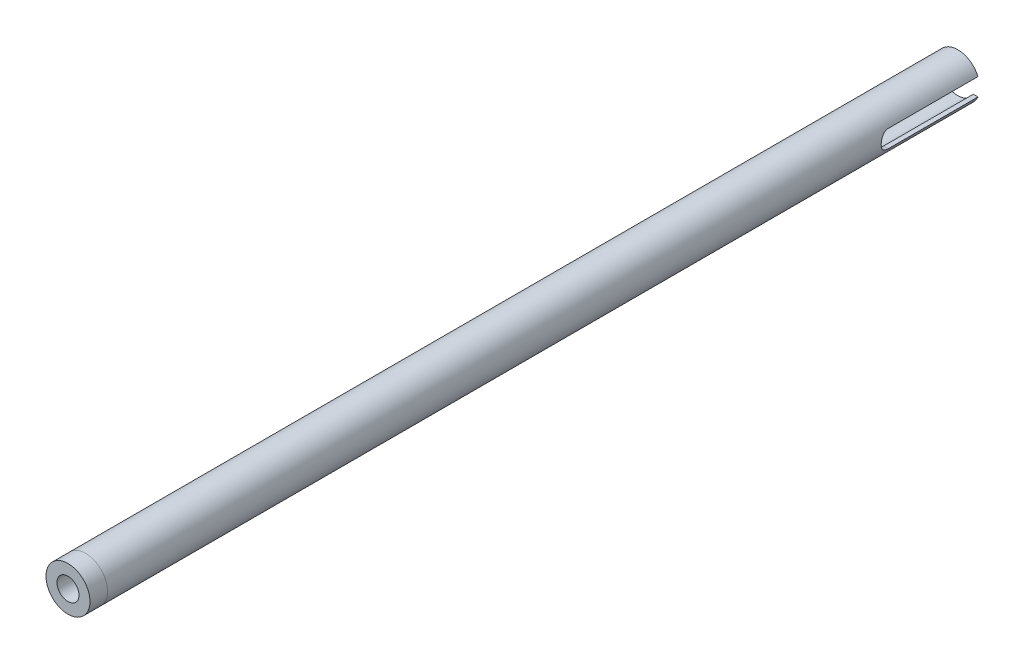
ISO-10303-21;
HEADER;
FILE_DESCRIPTION(('STEP AP214'),'2;1');
FILE_NAME('part.step','',(''),(''),'','','');
FILE_SCHEMA(('AUTOMOTIVE_DESIGN { 1 0 10303 214 1 1 1 1 }'));
ENDSEC;
DATA;
#1=APPLICATION_CONTEXT('core data for automotive mechanical design processes');
#2=APPLICATION_PROTOCOL_DEFINITION('international standard','automotive_design',2000,#1);
#3=PRODUCT_CONTEXT('',#1,'mechanical');
#4=PRODUCT('Part','Part','',(#3));
#5=PRODUCT_RELATED_PRODUCT_CATEGORY('part','',(#4));
#6=PRODUCT_DEFINITION_FORMATION('','',#4);
#7=PRODUCT_DEFINITION_CONTEXT('part definition',#1,'design');
#8=PRODUCT_DEFINITION('design','',#6,#7);
#9=PRODUCT_DEFINITION_SHAPE('','',#8);
#10=(LENGTH_UNIT() NAMED_UNIT(*) SI_UNIT(.MILLI.,.METRE.));
#11=(NAMED_UNIT(*) PLANE_ANGLE_UNIT() SI_UNIT($,.RADIAN.));
#12=(NAMED_UNIT(*) SI_UNIT($,.STERADIAN.) SOLID_ANGLE_UNIT());
#13=UNCERTAINTY_MEASURE_WITH_UNIT(LENGTH_MEASURE(1.E-05),#10,'distance_accuracy_value','');
#14=(GEOMETRIC_REPRESENTATION_CONTEXT(3) GLOBAL_UNCERTAINTY_ASSIGNED_CONTEXT((#13)) GLOBAL_UNIT_ASSIGNED_CONTEXT((#10,
#11,#12)) REPRESENTATION_CONTEXT('',''));
#15=CARTESIAN_POINT('',(0.,0.,0.));
#16=DIRECTION('',(0.,0.,1.));
#17=DIRECTION('',(1.,0.,0.));
#18=AXIS2_PLACEMENT_3D('',#15,#16,#17);
#19=CARTESIAN_POINT('',(0.,0.,-320.87871921738));
#20=DIRECTION('',(0.,0.,1.));
#21=DIRECTION('',(1.,0.,0.));
#22=AXIS2_PLACEMENT_3D('',#19,#20,#21);
#23=CYLINDRICAL_SURFACE('',#22,7.9375);
#24=CARTESIAN_POINT('',(0.,0.,-6.35));
#25=DIRECTION('',(0.,0.,1.));
#26=DIRECTION('',(1.,0.,0.));
#27=AXIS2_PLACEMENT_3D('',#24,#25,#26);
#28=CIRCLE('',#27,7.9375);
#29=CARTESIAN_POINT('',(7.9375,0.,-6.35));
#30=VERTEX_POINT('',#29);
#31=EDGE_CURVE('E167',#30,#30,#28,.T.);
#32=ORIENTED_EDGE('',*,*,#31,.F.);
#33=EDGE_LOOP('',(#32));
#34=FACE_BOUND('',#33,.T.);
#35=CARTESIAN_POINT('',(-7.2748389157424,3.175,-288.49371921738));
#36=CARTESIAN_POINT('',(-7.27482137043434,3.17501267173453,-288.408299101898));
#37=CARTESIAN_POINT('',(-7.27634297592672,3.17155313247793,-288.322888572335));
#38=CARTESIAN_POINT('',(-7.28233338484875,3.15778866907725,-288.152756568007));
#39=CARTESIAN_POINT('',(-7.28680106535325,3.14748635311323,-288.068034843148));
#40=CARTESIAN_POINT('',(-7.2985291631267,3.12019002880163,-287.900221143339));
#41=CARTESIAN_POINT('',(-7.30577831906487,3.10322299732752,-287.81712399858));
#42=CARTESIAN_POINT('',(-7.32282161153744,3.06278779397035,-287.652812896554));
#43=CARTESIAN_POINT('',(-7.33261590324725,3.03931922568674,-287.571599054441));
#44=CARTESIAN_POINT('',(-7.36535331460444,2.95952924342962,-287.331774231858));
#45=CARTESIAN_POINT('',(-7.39167595677839,2.89376893609239,-287.176649303055));
#46=CARTESIAN_POINT('',(-7.45033259991547,2.73920602658923,-286.879561876343));
#47=CARTESIAN_POINT('',(-7.48267254395243,2.65038060922872,-286.737612601125));
#48=CARTESIAN_POINT('',(-7.55175295441386,2.44684429809695,-286.462891831606));
#49=CARTESIAN_POINT('',(-7.58863404630154,2.33103943595689,-286.330964447094));
#50=CARTESIAN_POINT('',(-7.66147718953598,2.07914562663536,-286.087801563462));
#51=CARTESIAN_POINT('',(-7.69743902899202,1.94305205135848,-285.976570798534));
#52=CARTESIAN_POINT('',(-7.76611692840651,1.64778282664419,-285.773649599039));
#53=CARTESIAN_POINT('',(-7.79864638434712,1.48790317306356,-285.682915187635));
#54=CARTESIAN_POINT('',(-7.85502980346525,1.15369615984563,-285.530057634218));
#55=CARTESIAN_POINT('',(-7.87889360585224,0.979385463602722,-285.4679020216));
#56=CARTESIAN_POINT('',(-7.91022225039827,0.670405323433354,-285.387390377944));
#57=CARTESIAN_POINT('',(-7.92038443902171,0.537888188660439,-285.361712454535));
#58=CARTESIAN_POINT('',(-7.93061686811603,0.337231082382107,-285.335957371453));
#59=CARTESIAN_POINT('',(-7.93319257341971,0.269991647180298,-285.329499274173));
#60=CARTESIAN_POINT('',(-7.93663621925193,0.135173873369596,-285.320878256421));
#61=CARTESIAN_POINT('',(-7.93750363389236,0.0675954368175869,-285.318716658602));
#62=CARTESIAN_POINT('',(-7.9375,0.,-285.31871921738));
#63=B_SPLINE_CURVE_WITH_KNOTS('',3,(#35,#36,#37,#38,#39,#40,#41,#42,#43,#44,#45,#46,#47,#48,#49,
#50,#51,#52,#53,#54,#55,#56,#57,#58,#59,#60,#61,#62),.UNSPECIFIED.,.F.,.F.,(4,2,2,2,2,2,2,2,2,2,
2,2,2,4),(0.,0.256160797396612,0.512224013007058,0.767261264672238,1.02231406945471,
1.53142416248594,2.04103978047897,2.57679273649398,3.11266809162683,3.66991136029742,
4.22651992730645,4.63134321412666,4.8339937586662,5.03670667834028),.UNSPECIFIED.);
#64=CARTESIAN_POINT('',(-7.2748389157424,3.175,-288.49371921738));
#65=VERTEX_POINT('',#64);
#66=CARTESIAN_POINT('',(-7.9375,0.,-285.31871921738));
#67=VERTEX_POINT('',#66);
#68=EDGE_CURVE('E194',#65,#67,#63,.T.);
#69=ORIENTED_EDGE('',*,*,#68,.T.);
#70=CARTESIAN_POINT('',(-7.9375,0.,-285.31871921738));
#71=CARTESIAN_POINT('',(-7.93751279435796,-0.08569732438932,-285.318707187211));
#72=CARTESIAN_POINT('',(-7.93611246860092,-0.171386675169294,-285.322188554683));
#73=CARTESIAN_POINT('',(-7.93058107051394,-0.342092796869093,-285.336044650017));
#74=CARTESIAN_POINT('',(-7.92645080745519,-0.427109759557725,-285.346417335001));
#75=CARTESIAN_POINT('',(-7.91557399086504,-0.595570690948326,-285.373914529068));
#76=CARTESIAN_POINT('',(-7.90883664469869,-0.679019123580016,-285.391015280341));
#77=CARTESIAN_POINT('',(-7.89293284658536,-0.844038966454648,-285.431782527815));
#78=CARTESIAN_POINT('',(-7.88376629739099,-0.925610301410305,-285.455449286871));
#79=CARTESIAN_POINT('',(-7.85297007832481,-1.16656173687588,-285.53595694257));
#80=CARTESIAN_POINT('',(-7.82802544143958,-1.32244720282989,-285.602349575447));
#81=CARTESIAN_POINT('',(-7.77174407779742,-1.62081902572888,-285.75839497944));
#82=CARTESIAN_POINT('',(-7.74040257287306,-1.7632952496653,-285.848065151503));
#83=CARTESIAN_POINT('',(-7.67287736621953,-2.03755465224644,-286.052518759018));
#84=CARTESIAN_POINT('',(-7.63654472176442,-2.16862853615059,-286.16820561575));
#85=CARTESIAN_POINT('',(-7.56380976030912,-2.41011022612819,-286.419499717459));
#86=CARTESIAN_POINT('',(-7.52740741976911,-2.52050895891189,-286.555115661941));
#87=CARTESIAN_POINT('',(-7.45683282624284,-2.72240939900242,-286.849814156807));
#88=CARTESIAN_POINT('',(-7.4228346735038,-2.81283701743189,-287.009678146723));
#89=CARTESIAN_POINT('',(-7.3633362219632,-2.96511894168388,-287.343804111519));
#90=CARTESIAN_POINT('',(-7.33782422493328,-3.02701262758154,-287.518045849279));
#91=CARTESIAN_POINT('',(-7.30424985403508,-3.10695047193342,-287.82634957393));
#92=CARTESIAN_POINT('',(-7.29331360019113,-3.13238569878909,-287.958208334816));
#93=CARTESIAN_POINT('',(-7.28227977674291,-3.15790858319001,-288.15792521651));
#94=CARTESIAN_POINT('',(-7.27949685702346,-3.16431127275807,-288.224873507269));
#95=CARTESIAN_POINT('',(-7.27577355567174,-3.17285909036155,-288.359115065136));
#96=CARTESIAN_POINT('',(-7.27483380475762,-3.1750027609968,-288.426408442434));
#97=CARTESIAN_POINT('',(-7.2748389157424,-3.175,-288.49371921738));
#98=B_SPLINE_CURVE_WITH_KNOTS('',3,(#70,#71,#72,#73,#74,#75,#76,#77,#78,#79,#80,#81,#82,#83,#84,
#85,#86,#87,#88,#89,#90,#91,#92,#93,#94,#95,#96,#97),.UNSPECIFIED.,.F.,.F.,(4,2,2,2,2,2,2,2,2,2,
2,2,2,4),(0.,0.256996432008011,0.513916713336987,0.769937797705391,1.02596913282157,
1.53722547809954,2.04886511530059,2.58219314099272,3.11575467201799,3.67332953074261,
4.2301325519037,4.63306130520182,4.83485003827446,5.03670780985613),.UNSPECIFIED.);
#99=CARTESIAN_POINT('',(-7.2748389157424,-3.175,-288.49371921738));
#100=VERTEX_POINT('',#99);
#101=EDGE_CURVE('E146',#67,#100,#98,.T.);
#102=ORIENTED_EDGE('',*,*,#101,.T.);
#103=DIRECTION('',(0.,0.,-1.));
#104=VECTOR('',#103,1.);
#105=CARTESIAN_POINT('',(-7.2748389157424,-3.175,-285.31871921738));
#106=LINE('',#105,#104);
#107=CARTESIAN_POINT('',(-7.2748389157424,-3.175,-320.87871921738));
#108=VERTEX_POINT('',#107);
#109=EDGE_CURVE('E141',#100,#108,#106,.T.);
#110=ORIENTED_EDGE('',*,*,#109,.T.);
#111=CARTESIAN_POINT('',(0.,0.,-320.87871921738));
#112=DIRECTION('',(0.,0.,1.));
#113=DIRECTION('',(1.,0.,0.));
#114=AXIS2_PLACEMENT_3D('',#111,#112,#113);
#115=CIRCLE('',#114,7.9375);
#116=CARTESIAN_POINT('',(7.2748389157424,-3.175,-320.87871921738));
#117=VERTEX_POINT('',#116);
#118=EDGE_CURVE('E144',#108,#117,#115,.T.);
#119=ORIENTED_EDGE('',*,*,#118,.T.);
#120=DIRECTION('',(0.,0.,-1.));
#121=VECTOR('',#120,1.);
#122=CARTESIAN_POINT('',(7.2748389157424,-3.175,-285.31871921738));
#123=LINE('',#122,#121);
#124=CARTESIAN_POINT('',(7.2748389157424,-3.175,-288.49371921738));
#125=VERTEX_POINT('',#124);
#126=EDGE_CURVE('E427',#125,#117,#123,.T.);
#127=ORIENTED_EDGE('',*,*,#126,.F.);
#128=CARTESIAN_POINT('',(7.2748389157424,-3.175,-288.49371921738));
#129=CARTESIAN_POINT('',(7.27482137043434,-3.17501267173453,-288.408299101898));
#130=CARTESIAN_POINT('',(7.27634297592672,-3.17155313247793,-288.322888572335));
#131=CARTESIAN_POINT('',(7.28233338484875,-3.15778866907725,-288.152756568007));
#132=CARTESIAN_POINT('',(7.28680106535325,-3.14748635311323,-288.068034843148));
#133=CARTESIAN_POINT('',(7.2985291631267,-3.12019002880163,-287.900221143339));
#134=CARTESIAN_POINT('',(7.30577831906487,-3.10322299732752,-287.81712399858));
#135=CARTESIAN_POINT('',(7.32282161153744,-3.06278779397035,-287.652812896554));
#136=CARTESIAN_POINT('',(7.33261590324725,-3.03931922568674,-287.571599054441));
#137=CARTESIAN_POINT('',(7.36535331460444,-2.95952924342962,-287.331774231858));
#138=CARTESIAN_POINT('',(7.39167595677839,-2.89376893609239,-287.176649303055));
#139=CARTESIAN_POINT('',(7.45033259991547,-2.73920602658923,-286.879561876343));
#140=CARTESIAN_POINT('',(7.48267254395243,-2.65038060922872,-286.737612601125));
#141=CARTESIAN_POINT('',(7.55175295441386,-2.44684429809695,-286.462891831606));
#142=CARTESIAN_POINT('',(7.58863404630154,-2.33103943595689,-286.330964447094));
#143=CARTESIAN_POINT('',(7.66147718953598,-2.07914562663536,-286.087801563462));
#144=CARTESIAN_POINT('',(7.69743902899202,-1.94305205135848,-285.976570798534));
#145=CARTESIAN_POINT('',(7.76611692840651,-1.64778282664419,-285.773649599039));
#146=CARTESIAN_POINT('',(7.79864638434712,-1.48790317306356,-285.682915187635));
#147=CARTESIAN_POINT('',(7.85502980346525,-1.15369615984563,-285.530057634218));
#148=CARTESIAN_POINT('',(7.87889360585224,-0.979385463602722,-285.4679020216));
#149=CARTESIAN_POINT('',(7.91022225039827,-0.670405323433354,-285.387390377944));
#150=CARTESIAN_POINT('',(7.92038443902171,-0.537888188660439,-285.361712454535));
#151=CARTESIAN_POINT('',(7.93061686811603,-0.337231082382107,-285.335957371453));
#152=CARTESIAN_POINT('',(7.93319257341971,-0.269991647180298,-285.329499274173));
#153=CARTESIAN_POINT('',(7.93663621925193,-0.135173873369596,-285.320878256421));
#154=CARTESIAN_POINT('',(7.93750363389236,-0.0675954368175869,-285.318716658602));
#155=CARTESIAN_POINT('',(7.9375,0.,-285.31871921738));
#156=B_SPLINE_CURVE_WITH_KNOTS('',3,(#128,#129,#130,#131,#132,#133,#134,#135,#136,#137,#138,
#139,#140,#141,#142,#143,#144,#145,#146,#147,#148,#149,#150,#151,#152,#153,#154,#155),
.UNSPECIFIED.,.F.,.F.,(4,2,2,2,2,2,2,2,2,2,2,2,2,4),(0.,0.256160797396612,0.512224013007058,
0.767261264672238,1.02231406945471,1.53142416248594,2.04103978047897,2.57679273649398,
3.11266809162683,3.66991136029742,4.22651992730645,4.63134321412666,4.8339937586662,
5.03670667834028),.UNSPECIFIED.);
#157=CARTESIAN_POINT('',(7.9375,0.,-285.31871921738));
#158=VERTEX_POINT('',#157);
#159=EDGE_CURVE('E87',#125,#158,#156,.T.);
#160=ORIENTED_EDGE('',*,*,#159,.T.);
#161=CARTESIAN_POINT('',(7.9375,0.,-285.31871921738));
#162=CARTESIAN_POINT('',(7.93751279435796,0.08569732438932,-285.318707187211));
#163=CARTESIAN_POINT('',(7.93611246860092,0.171386675169294,-285.322188554683));
#164=CARTESIAN_POINT('',(7.93058107051394,0.342092796869093,-285.336044650017));
#165=CARTESIAN_POINT('',(7.92645080745519,0.427109759557725,-285.346417335001));
#166=CARTESIAN_POINT('',(7.91557399086504,0.595570690948326,-285.373914529068));
#167=CARTESIAN_POINT('',(7.90883664469869,0.679019123580016,-285.391015280341));
#168=CARTESIAN_POINT('',(7.89293284658536,0.844038966454648,-285.431782527815));
#169=CARTESIAN_POINT('',(7.88376629739099,0.925610301410305,-285.455449286871));
#170=CARTESIAN_POINT('',(7.85297007832481,1.16656173687588,-285.53595694257));
#171=CARTESIAN_POINT('',(7.82802544143958,1.32244720282989,-285.602349575447));
#172=CARTESIAN_POINT('',(7.77174407779742,1.62081902572888,-285.75839497944));
#173=CARTESIAN_POINT('',(7.74040257287306,1.7632952496653,-285.848065151503));
#174=CARTESIAN_POINT('',(7.67287736621953,2.03755465224644,-286.052518759018));
#175=CARTESIAN_POINT('',(7.63654472176442,2.16862853615059,-286.16820561575));
#176=CARTESIAN_POINT('',(7.56380976030912,2.41011022612819,-286.419499717459));
#177=CARTESIAN_POINT('',(7.52740741976911,2.52050895891189,-286.555115661941));
#178=CARTESIAN_POINT('',(7.45683282624284,2.72240939900242,-286.849814156807));
#179=CARTESIAN_POINT('',(7.4228346735038,2.81283701743189,-287.009678146723));
#180=CARTESIAN_POINT('',(7.3633362219632,2.96511894168388,-287.343804111519));
#181=CARTESIAN_POINT('',(7.33782422493328,3.02701262758154,-287.518045849279));
#182=CARTESIAN_POINT('',(7.30424985403508,3.10695047193342,-287.82634957393));
#183=CARTESIAN_POINT('',(7.29331360019113,3.13238569878909,-287.958208334816));
#184=CARTESIAN_POINT('',(7.28227977674291,3.15790858319001,-288.15792521651));
#185=CARTESIAN_POINT('',(7.27949685702346,3.16431127275807,-288.224873507269));
#186=CARTESIAN_POINT('',(7.27577355567174,3.17285909036155,-288.359115065136));
#187=CARTESIAN_POINT('',(7.27483380475762,3.1750027609968,-288.426408442434));
#188=CARTESIAN_POINT('',(7.2748389157424,3.175,-288.49371921738));
#189=B_SPLINE_CURVE_WITH_KNOTS('',3,(#161,#162,#163,#164,#165,#166,#167,#168,#169,#170,#171,
#172,#173,#174,#175,#176,#177,#178,#179,#180,#181,#182,#183,#184,#185,#186,#187,#188),
.UNSPECIFIED.,.F.,.F.,(4,2,2,2,2,2,2,2,2,2,2,2,2,4),(0.,0.256996432008011,0.513916713336987,
0.769937797705391,1.02596913282157,1.53722547809954,2.04886511530059,2.58219314099272,
3.11575467201799,3.67332953074261,4.2301325519037,4.63306130520182,4.83485003827446,
5.03670780985613),.UNSPECIFIED.);
#190=CARTESIAN_POINT('',(7.2748389157424,3.175,-288.49371921738));
#191=VERTEX_POINT('',#190);
#192=EDGE_CURVE('E73',#158,#191,#189,.T.);
#193=ORIENTED_EDGE('',*,*,#192,.T.);
#194=DIRECTION('',(0.,0.,-1.));
#195=VECTOR('',#194,1.);
#196=CARTESIAN_POINT('',(7.2748389157424,3.175,-285.31871921738));
#197=LINE('',#196,#195);
#198=CARTESIAN_POINT('',(7.2748389157424,3.175,-320.87871921738));
#199=VERTEX_POINT('',#198);
#200=EDGE_CURVE('E160',#191,#199,#197,.T.);
#201=ORIENTED_EDGE('',*,*,#200,.T.);
#202=CARTESIAN_POINT('',(-7.2748389157424,3.175,-320.87871921738));
#203=VERTEX_POINT('',#202);
#204=EDGE_CURVE('E166',#199,#203,#115,.T.);
#205=ORIENTED_EDGE('',*,*,#204,.T.);
#206=DIRECTION('',(0.,0.,-1.));
#207=VECTOR('',#206,1.);
#208=CARTESIAN_POINT('',(-7.2748389157424,3.175,-285.31871921738));
#209=LINE('',#208,#207);
#210=EDGE_CURVE('E420',#65,#203,#209,.T.);
#211=ORIENTED_EDGE('',*,*,#210,.F.);
#212=EDGE_LOOP('',(#69,#102,#110,#119,#127,#160,#193,#201,#205,#211));
#213=FACE_BOUND('',#212,.T.);
#214=ADVANCED_FACE('F63',(#34,#213),#23,.T.);
#215=CARTESIAN_POINT('',(0.,0.,-320.87871921738));
#216=DIRECTION('',(0.,0.,1.));
#217=DIRECTION('',(1.,0.,0.));
#218=AXIS2_PLACEMENT_3D('',#215,#216,#217);
#219=PLANE('',#218);
#220=DIRECTION('',(1.,0.,0.));
#221=VECTOR('',#220,1.);
#222=CARTESIAN_POINT('',(0.,-3.175,-320.87871921738));
#223=LINE('',#222,#221);
#224=CARTESIAN_POINT('',(-5.57246419907746,-3.175,-320.87871921738));
#225=VERTEX_POINT('',#224);
#226=EDGE_CURVE('E153',#108,#225,#223,.T.);
#227=ORIENTED_EDGE('',*,*,#226,.T.);
#228=CARTESIAN_POINT('',(0.,0.,-320.87871921738));
#229=DIRECTION('',(0.,0.,1.));
#230=DIRECTION('',(1.,0.,0.));
#231=AXIS2_PLACEMENT_3D('',#228,#229,#230);
#232=CIRCLE('',#231,6.4135);
#233=CARTESIAN_POINT('',(5.57246419907746,-3.175,-320.87871921738));
#234=VERTEX_POINT('',#233);
#235=EDGE_CURVE('E275',#225,#234,#232,.T.);
#236=ORIENTED_EDGE('',*,*,#235,.T.);
#237=DIRECTION('',(1.,0.,0.));
#238=VECTOR('',#237,1.);
#239=CARTESIAN_POINT('',(0.,-3.175,-320.87871921738));
#240=LINE('',#239,#238);
#241=EDGE_CURVE('E165',#234,#117,#240,.T.);
#242=ORIENTED_EDGE('',*,*,#241,.T.);
#243=ORIENTED_EDGE('',*,*,#118,.F.);
#244=EDGE_LOOP('',(#227,#236,#242,#243));
#245=FACE_BOUND('',#244,.T.);
#246=ADVANCED_FACE('F163',(#245),#219,.F.);
#247=CARTESIAN_POINT('',(0.,0.,-320.87871921738));
#248=DIRECTION('',(0.,0.,1.));
#249=DIRECTION('',(1.,0.,0.));
#250=AXIS2_PLACEMENT_3D('',#247,#248,#249);
#251=CYLINDRICAL_SURFACE('',#250,6.4135);
#252=CARTESIAN_POINT('',(0.,0.,-6.35));
#253=DIRECTION('',(0.,0.,1.));
#254=DIRECTION('',(1.,0.,0.));
#255=AXIS2_PLACEMENT_3D('',#252,#253,#254);
#256=CIRCLE('',#255,6.4135);
#257=CARTESIAN_POINT('',(6.4135,0.,-6.35));
#258=VERTEX_POINT('',#257);
#259=EDGE_CURVE('E149',#258,#258,#256,.T.);
#260=ORIENTED_EDGE('',*,*,#259,.T.);
#261=EDGE_LOOP('',(#260));
#262=FACE_BOUND('',#261,.T.);
#263=DIRECTION('',(0.,0.,-1.));
#264=VECTOR('',#263,1.);
#265=CARTESIAN_POINT('',(-5.57246419907746,-3.175,-285.31871921738));
#266=LINE('',#265,#264);
#267=CARTESIAN_POINT('',(-5.57246419907746,-3.175,-288.49371921738));
#268=VERTEX_POINT('',#267);
#269=EDGE_CURVE('E150',#268,#225,#266,.T.);
#270=ORIENTED_EDGE('',*,*,#269,.F.);
#271=CARTESIAN_POINT('',(-5.57246419907746,-3.175,-288.49371921738));
#272=CARTESIAN_POINT('',(-5.57244013006406,-3.17501485930532,-288.410440104341));
#273=CARTESIAN_POINT('',(-5.57433046393327,-3.17172393593588,-288.327174337471));
#274=CARTESIAN_POINT('',(-5.58175879139227,-3.15864741746939,-288.161366752659));
#275=CARTESIAN_POINT('',(-5.58729459414879,-3.14886572313217,-288.078824530058));
#276=CARTESIAN_POINT('',(-5.60179156831922,-3.12299843383605,-287.915527723329));
#277=CARTESIAN_POINT('',(-5.61073298145,-3.10694918790095,-287.834765618415));
#278=CARTESIAN_POINT('',(-5.63171276239417,-3.06875665913499,-287.675121702914));
#279=CARTESIAN_POINT('',(-5.64375147558632,-3.04661269666535,-287.596240103094));
#280=CARTESIAN_POINT('',(-5.6838799338154,-2.97148657354666,-287.363506928096));
#281=CARTESIAN_POINT('',(-5.71602843451584,-2.90973243042152,-287.213086430857));
#282=CARTESIAN_POINT('',(-5.78746445334561,-2.76491119647661,-286.924629214029));
#283=CARTESIAN_POINT('',(-5.8267630725243,-2.68181088046089,-286.786612256663));
#284=CARTESIAN_POINT('',(-5.91189137020974,-2.48887418737119,-286.514815172634));
#285=CARTESIAN_POINT('',(-5.95799203211627,-2.37743022169016,-286.382258370183));
#286=CARTESIAN_POINT('',(-6.04933625068999,-2.13433179626949,-286.13679070111));
#287=CARTESIAN_POINT('',(-6.09457954365871,-2.00267122837297,-286.023885794097));
#288=CARTESIAN_POINT('',(-6.18270630442022,-1.71220053093684,-285.813566501645));
#289=CARTESIAN_POINT('',(-6.22523407848511,-1.55216870534977,-285.717676751214));
#290=CARTESIAN_POINT('',(-6.29953728626817,-1.21586879246633,-285.554827854897));
#291=CARTESIAN_POINT('',(-6.33132906884324,-1.03962591706377,-285.487824676854));
#292=CARTESIAN_POINT('',(-6.37455801221378,-0.719418942476251,-285.397952844523));
#293=CARTESIAN_POINT('',(-6.38903678436651,-0.577736145507957,-285.368380130159));
#294=CARTESIAN_POINT('',(-6.40364692368403,-0.362616983152034,-285.338659055844));
#295=CARTESIAN_POINT('',(-6.40733246196224,-0.290370591494075,-285.331191543207));
#296=CARTESIAN_POINT('',(-6.41226237468065,-0.145424356491903,-285.321218654269));
#297=CARTESIAN_POINT('',(-6.41350576158006,-0.0727243416303698,-285.318715285332));
#298=CARTESIAN_POINT('',(-6.4135,0.,-285.31871921738));
#299=B_SPLINE_CURVE_WITH_KNOTS('',3,(#271,#272,#273,#274,#275,#276,#277,#278,#279,#280,#281,
#282,#283,#284,#285,#286,#287,#288,#289,#290,#291,#292,#293,#294,#295,#296,#297,#298),
.UNSPECIFIED.,.F.,.F.,(4,2,2,2,2,2,2,2,2,2,2,2,2,4),(0.,0.249729002226608,0.499308060527582,
0.747460667546715,0.995640957972498,1.49055300136654,1.98624009021394,2.52160227908797,
3.05712653941521,3.62817923327589,4.19835836008502,4.63305000595099,4.85103401853339,
5.06910615989469),.UNSPECIFIED.);
#300=CARTESIAN_POINT('',(-6.4135,0.,-285.31871921738));
#301=VERTEX_POINT('',#300);
#302=EDGE_CURVE('E221',#268,#301,#299,.T.);
#303=ORIENTED_EDGE('',*,*,#302,.T.);
#304=CARTESIAN_POINT('',(-6.4135,0.,-285.31871921738));
#305=CARTESIAN_POINT('',(-6.41351478956105,0.0839162873638195,-285.318705817484));
#306=CARTESIAN_POINT('',(-6.41185341043851,0.167823114288182,-285.322045743531));
#307=CARTESIAN_POINT('',(-6.40528923860734,0.33495253632637,-285.335328184136));
#308=CARTESIAN_POINT('',(-6.40038773102953,0.418175389480093,-285.345268080957));
#309=CARTESIAN_POINT('',(-6.38748331817869,0.58296549878522,-285.371586885475));
#310=CARTESIAN_POINT('',(-6.37949454331383,0.664538541389253,-285.387936460963));
#311=CARTESIAN_POINT('',(-6.36062930478242,0.825821595252368,-285.426874764556));
#312=CARTESIAN_POINT('',(-6.34975266552956,0.905531492908811,-285.449463872037));
#313=CARTESIAN_POINT('',(-6.31319792977548,1.14087800407252,-285.526200434797));
#314=CARTESIAN_POINT('',(-6.28356695572383,1.29306927815055,-285.589372082985));
#315=CARTESIAN_POINT('',(-6.21648032622801,1.58455945770353,-285.737522824965));
#316=CARTESIAN_POINT('',(-6.17901685649499,1.72384528592309,-285.822523716744));
#317=CARTESIAN_POINT('',(-6.09713913910647,1.99475482128856,-286.017623854996));
#318=CARTESIAN_POINT('',(-6.05244508581476,2.12544046453043,-286.128908731734));
#319=CARTESIAN_POINT('',(-5.96206469267669,2.36716277188881,-286.370878177899));
#320=CARTESIAN_POINT('',(-5.9163776032387,2.47818397002904,-286.501577869739));
#321=CARTESIAN_POINT('',(-5.82517699615972,2.68591268931947,-286.790623698691));
#322=CARTESIAN_POINT('',(-5.77994318763785,2.78087960507694,-286.950318893271));
#323=CARTESIAN_POINT('',(-5.69959190124919,2.9420744279085,-287.285702170453));
#324=CARTESIAN_POINT('',(-5.66445328320705,3.00836254036259,-287.461355803624));
#325=CARTESIAN_POINT('',(-5.61637168534323,3.09697219420915,-287.779807178018));
#326=CARTESIAN_POINT('',(-5.60011055849822,3.1260622343607,-287.920221780678));
#327=CARTESIAN_POINT('',(-5.58363385282995,3.15533369889112,-288.13359865892));
#328=CARTESIAN_POINT('',(-5.57946041232981,3.16269716900745,-288.205330383802));
#329=CARTESIAN_POINT('',(-5.57386984218861,3.17253394278506,-288.349272323845));
#330=CARTESIAN_POINT('',(-5.57245416126573,3.17500467618403,-288.421482770516));
#331=CARTESIAN_POINT('',(-5.57246419907746,3.175,-288.49371921738));
#332=B_SPLINE_CURVE_WITH_KNOTS('',3,(#304,#305,#306,#307,#308,#309,#310,#311,#312,#313,#314,
#315,#316,#317,#318,#319,#320,#321,#322,#323,#324,#325,#326,#327,#328,#329,#330,#331),
.UNSPECIFIED.,.F.,.F.,(4,2,2,2,2,2,2,2,2,2,2,2,2,4),(0.,0.251650249697328,0.503200747298848,
0.75361328099314,1.00404104361821,1.50387930503274,2.00421864304453,2.53410176460237,
3.06439980342596,3.63519589642624,4.20478783377489,4.63602373673194,4.85251353275904,
5.06911702550462),.UNSPECIFIED.);
#333=CARTESIAN_POINT('',(-5.57246419907746,3.175,-288.49371921738));
#334=VERTEX_POINT('',#333);
#335=EDGE_CURVE('E186',#301,#334,#332,.T.);
#336=ORIENTED_EDGE('',*,*,#335,.T.);
#337=DIRECTION('',(0.,0.,-1.));
#338=VECTOR('',#337,1.);
#339=CARTESIAN_POINT('',(-5.57246419907746,3.175,-285.31871921738));
#340=LINE('',#339,#338);
#341=CARTESIAN_POINT('',(-5.57246419907746,3.175,-320.87871921738));
#342=VERTEX_POINT('',#341);
#343=EDGE_CURVE('E417',#334,#342,#340,.T.);
#344=ORIENTED_EDGE('',*,*,#343,.T.);
#345=CARTESIAN_POINT('',(5.57246419907746,3.175,-320.87871921738));
#346=VERTEX_POINT('',#345);
#347=EDGE_CURVE('E172',#346,#342,#232,.T.);
#348=ORIENTED_EDGE('',*,*,#347,.F.);
#349=DIRECTION('',(0.,0.,-1.));
#350=VECTOR('',#349,1.);
#351=CARTESIAN_POINT('',(5.57246419907746,3.175,-285.31871921738));
#352=LINE('',#351,#350);
#353=CARTESIAN_POINT('',(5.57246419907746,3.175,-288.49371921738));
#354=VERTEX_POINT('',#353);
#355=EDGE_CURVE('E269',#354,#346,#352,.T.);
#356=ORIENTED_EDGE('',*,*,#355,.F.);
#357=CARTESIAN_POINT('',(5.57246419907746,3.175,-288.49371921738));
#358=CARTESIAN_POINT('',(5.57244013006406,3.17501485930532,-288.410440104341));
#359=CARTESIAN_POINT('',(5.57433046393327,3.17172393593588,-288.327174337471));
#360=CARTESIAN_POINT('',(5.58175879139227,3.15864741746939,-288.161366752659));
#361=CARTESIAN_POINT('',(5.58729459414879,3.14886572313217,-288.078824530058));
#362=CARTESIAN_POINT('',(5.60179156831922,3.12299843383605,-287.915527723329));
#363=CARTESIAN_POINT('',(5.61073298145,3.10694918790095,-287.834765618415));
#364=CARTESIAN_POINT('',(5.63171276239417,3.06875665913499,-287.675121702914));
#365=CARTESIAN_POINT('',(5.64375147558632,3.04661269666535,-287.596240103094));
#366=CARTESIAN_POINT('',(5.6838799338154,2.97148657354666,-287.363506928096));
#367=CARTESIAN_POINT('',(5.71602843451584,2.90973243042152,-287.213086430857));
#368=CARTESIAN_POINT('',(5.78746445334561,2.76491119647661,-286.924629214029));
#369=CARTESIAN_POINT('',(5.8267630725243,2.68181088046089,-286.786612256663));
#370=CARTESIAN_POINT('',(5.91189137020974,2.48887418737119,-286.514815172634));
#371=CARTESIAN_POINT('',(5.95799203211627,2.37743022169016,-286.382258370183));
#372=CARTESIAN_POINT('',(6.04933625068999,2.13433179626949,-286.13679070111));
#373=CARTESIAN_POINT('',(6.09457954365871,2.00267122837297,-286.023885794097));
#374=CARTESIAN_POINT('',(6.18270630442022,1.71220053093684,-285.813566501645));
#375=CARTESIAN_POINT('',(6.22523407848511,1.55216870534977,-285.717676751214));
#376=CARTESIAN_POINT('',(6.29953728626817,1.21586879246633,-285.554827854897));
#377=CARTESIAN_POINT('',(6.33132906884324,1.03962591706377,-285.487824676854));
#378=CARTESIAN_POINT('',(6.37455801221378,0.719418942476251,-285.397952844523));
#379=CARTESIAN_POINT('',(6.38903678436651,0.577736145507957,-285.368380130159));
#380=CARTESIAN_POINT('',(6.40364692368403,0.362616983152034,-285.338659055844));
#381=CARTESIAN_POINT('',(6.40733246196224,0.290370591494075,-285.331191543207));
#382=CARTESIAN_POINT('',(6.41226237468065,0.145424356491903,-285.321218654269));
#383=CARTESIAN_POINT('',(6.41350576158006,0.0727243416303698,-285.318715285332));
#384=CARTESIAN_POINT('',(6.4135,0.,-285.31871921738));
#385=B_SPLINE_CURVE_WITH_KNOTS('',3,(#357,#358,#359,#360,#361,#362,#363,#364,#365,#366,#367,
#368,#369,#370,#371,#372,#373,#374,#375,#376,#377,#378,#379,#380,#381,#382,#383,#384),
.UNSPECIFIED.,.F.,.F.,(4,2,2,2,2,2,2,2,2,2,2,2,2,4),(0.,0.249729002226608,0.499308060527582,
0.747460667546715,0.995640957972498,1.49055300136654,1.98624009021394,2.52160227908797,
3.05712653941521,3.62817923327589,4.19835836008502,4.63305000595099,4.85103401853339,
5.06910615989469),.UNSPECIFIED.);
#386=CARTESIAN_POINT('',(6.4135,0.,-285.31871921738));
#387=VERTEX_POINT('',#386);
#388=EDGE_CURVE('E13',#354,#387,#385,.T.);
#389=ORIENTED_EDGE('',*,*,#388,.T.);
#390=CARTESIAN_POINT('',(6.4135,0.,-285.31871921738));
#391=CARTESIAN_POINT('',(6.41351478956105,-0.0839162873638195,-285.318705817484));
#392=CARTESIAN_POINT('',(6.41185341043851,-0.167823114288182,-285.322045743531));
#393=CARTESIAN_POINT('',(6.40528923860734,-0.33495253632637,-285.335328184136));
#394=CARTESIAN_POINT('',(6.40038773102953,-0.418175389480093,-285.345268080957));
#395=CARTESIAN_POINT('',(6.38748331817869,-0.58296549878522,-285.371586885475));
#396=CARTESIAN_POINT('',(6.37949454331383,-0.664538541389253,-285.387936460963));
#397=CARTESIAN_POINT('',(6.36062930478242,-0.825821595252368,-285.426874764556));
#398=CARTESIAN_POINT('',(6.34975266552956,-0.905531492908811,-285.449463872037));
#399=CARTESIAN_POINT('',(6.31319792977548,-1.14087800407252,-285.526200434797));
#400=CARTESIAN_POINT('',(6.28356695572383,-1.29306927815055,-285.589372082985));
#401=CARTESIAN_POINT('',(6.21648032622801,-1.58455945770353,-285.737522824965));
#402=CARTESIAN_POINT('',(6.17901685649499,-1.72384528592309,-285.822523716744));
#403=CARTESIAN_POINT('',(6.09713913910647,-1.99475482128856,-286.017623854996));
#404=CARTESIAN_POINT('',(6.05244508581476,-2.12544046453043,-286.128908731734));
#405=CARTESIAN_POINT('',(5.96206469267669,-2.36716277188881,-286.370878177899));
#406=CARTESIAN_POINT('',(5.9163776032387,-2.47818397002904,-286.501577869739));
#407=CARTESIAN_POINT('',(5.82517699615972,-2.68591268931947,-286.790623698691));
#408=CARTESIAN_POINT('',(5.77994318763785,-2.78087960507694,-286.950318893271));
#409=CARTESIAN_POINT('',(5.69959190124919,-2.9420744279085,-287.285702170453));
#410=CARTESIAN_POINT('',(5.66445328320705,-3.00836254036259,-287.461355803624));
#411=CARTESIAN_POINT('',(5.61637168534323,-3.09697219420915,-287.779807178018));
#412=CARTESIAN_POINT('',(5.60011055849822,-3.1260622343607,-287.920221780678));
#413=CARTESIAN_POINT('',(5.58363385282995,-3.15533369889112,-288.13359865892));
#414=CARTESIAN_POINT('',(5.57946041232981,-3.16269716900745,-288.205330383802));
#415=CARTESIAN_POINT('',(5.57386984218861,-3.17253394278506,-288.349272323845));
#416=CARTESIAN_POINT('',(5.57245416126573,-3.17500467618403,-288.421482770516));
#417=CARTESIAN_POINT('',(5.57246419907746,-3.175,-288.49371921738));
#418=B_SPLINE_CURVE_WITH_KNOTS('',3,(#390,#391,#392,#393,#394,#395,#396,#397,#398,#399,#400,
#401,#402,#403,#404,#405,#406,#407,#408,#409,#410,#411,#412,#413,#414,#415,#416,#417),
.UNSPECIFIED.,.F.,.F.,(4,2,2,2,2,2,2,2,2,2,2,2,2,4),(0.,0.251650249697328,0.503200747298848,
0.75361328099314,1.00404104361821,1.50387930503274,2.00421864304453,2.53410176460237,
3.06439980342596,3.63519589642624,4.20478783377489,4.63602373673194,4.85251353275904,
5.06911702550462),.UNSPECIFIED.);
#419=CARTESIAN_POINT('',(5.57246419907746,-3.175,-288.49371921738));
#420=VERTEX_POINT('',#419);
#421=EDGE_CURVE('E237',#387,#420,#418,.T.);
#422=ORIENTED_EDGE('',*,*,#421,.T.);
#423=DIRECTION('',(0.,0.,-1.));
#424=VECTOR('',#423,1.);
#425=CARTESIAN_POINT('',(5.57246419907746,-3.175,-285.31871921738));
#426=LINE('',#425,#424);
#427=EDGE_CURVE('E271',#420,#234,#426,.T.);
#428=ORIENTED_EDGE('',*,*,#427,.T.);
#429=ORIENTED_EDGE('',*,*,#235,.F.);
#430=EDGE_LOOP('',(#270,#303,#336,#344,#348,#356,#389,#422,#428,#429));
#431=FACE_BOUND('',#430,.T.);
#432=ADVANCED_FACE('F201',(#262,#431),#251,.F.);
#433=ORIENTED_EDGE('',*,*,#347,.T.);
#434=DIRECTION('',(1.,0.,0.));
#435=VECTOR('',#434,1.);
#436=CARTESIAN_POINT('',(0.,3.175,-320.87871921738));
#437=LINE('',#436,#435);
#438=EDGE_CURVE('E159',#203,#342,#437,.T.);
#439=ORIENTED_EDGE('',*,*,#438,.F.);
#440=ORIENTED_EDGE('',*,*,#204,.F.);
#441=DIRECTION('',(1.,0.,0.));
#442=VECTOR('',#441,1.);
#443=CARTESIAN_POINT('',(0.,3.175,-320.87871921738));
#444=LINE('',#443,#442);
#445=EDGE_CURVE('E253',#346,#199,#444,.T.);
#446=ORIENTED_EDGE('',*,*,#445,.F.);
#447=EDGE_LOOP('',(#433,#439,#440,#446));
#448=FACE_BOUND('',#447,.T.);
#449=ADVANCED_FACE('F286',(#448),#219,.F.);
#450=CARTESIAN_POINT('',(0.,0.,-6.35));
#451=DIRECTION('',(0.,0.,1.));
#452=DIRECTION('',(1.,0.,0.));
#453=AXIS2_PLACEMENT_3D('',#450,#451,#452);
#454=PLANE('',#453);
#455=ORIENTED_EDGE('',*,*,#259,.F.);
#456=EDGE_LOOP('',(#455));
#457=FACE_BOUND('',#456,.T.);
#458=ORIENTED_EDGE('',*,*,#31,.T.);
#459=EDGE_LOOP('',(#458));
#460=FACE_BOUND('',#459,.T.);
#461=ADVANCED_FACE('F283',(#457,#460),#454,.T.);
#462=CARTESIAN_POINT('',(0.,3.175,-285.31871921738));
#463=DIRECTION('',(0.,1.,0.));
#464=DIRECTION('',(0.,0.,1.));
#465=AXIS2_PLACEMENT_3D('',#462,#463,#464);
#466=PLANE('',#465);
#467=ORIENTED_EDGE('',*,*,#200,.F.);
#468=DIRECTION('',(1.,0.,0.));
#469=VECTOR('',#468,1.);
#470=CARTESIAN_POINT('',(5.57246419907746,3.175,-288.49371921738));
#471=LINE('',#470,#469);
#472=EDGE_CURVE('E184',#191,#354,#471,.F.);
#473=ORIENTED_EDGE('',*,*,#472,.T.);
#474=ORIENTED_EDGE('',*,*,#355,.T.);
#475=ORIENTED_EDGE('',*,*,#445,.T.);
#476=EDGE_LOOP('',(#467,#473,#474,#475));
#477=FACE_BOUND('',#476,.T.);
#478=ADVANCED_FACE('F266',(#477),#466,.F.);
#479=CARTESIAN_POINT('',(0.,-3.175,-285.31871921738));
#480=DIRECTION('',(0.,1.,0.));
#481=DIRECTION('',(0.,0.,1.));
#482=AXIS2_PLACEMENT_3D('',#479,#480,#481);
#483=PLANE('',#482);
#484=ORIENTED_EDGE('',*,*,#427,.F.);
#485=DIRECTION('',(1.,0.,0.));
#486=VECTOR('',#485,1.);
#487=CARTESIAN_POINT('',(0.,-3.175,-288.49371921738));
#488=LINE('',#487,#486);
#489=EDGE_CURVE('E181',#420,#125,#488,.T.);
#490=ORIENTED_EDGE('',*,*,#489,.T.);
#491=ORIENTED_EDGE('',*,*,#126,.T.);
#492=ORIENTED_EDGE('',*,*,#241,.F.);
#493=EDGE_LOOP('',(#484,#490,#491,#492));
#494=FACE_BOUND('',#493,.T.);
#495=ADVANCED_FACE('F361',(#494),#483,.T.);
#496=CARTESIAN_POINT('',(0.,-3.175,-285.31871921738));
#497=DIRECTION('',(0.,1.,0.));
#498=DIRECTION('',(0.,0.,1.));
#499=AXIS2_PLACEMENT_3D('',#496,#497,#498);
#500=PLANE('',#499);
#501=ORIENTED_EDGE('',*,*,#109,.F.);
#502=DIRECTION('',(1.,0.,0.));
#503=VECTOR('',#502,1.);
#504=CARTESIAN_POINT('',(0.,-3.175,-288.49371921738));
#505=LINE('',#504,#503);
#506=EDGE_CURVE('E179',#100,#268,#505,.T.);
#507=ORIENTED_EDGE('',*,*,#506,.T.);
#508=ORIENTED_EDGE('',*,*,#269,.T.);
#509=ORIENTED_EDGE('',*,*,#226,.F.);
#510=EDGE_LOOP('',(#501,#507,#508,#509));
#511=FACE_BOUND('',#510,.T.);
#512=ADVANCED_FACE('F154',(#511),#500,.T.);
#513=CARTESIAN_POINT('',(0.,3.175,-285.31871921738));
#514=DIRECTION('',(0.,1.,0.));
#515=DIRECTION('',(0.,0.,1.));
#516=AXIS2_PLACEMENT_3D('',#513,#514,#515);
#517=PLANE('',#516);
#518=ORIENTED_EDGE('',*,*,#343,.F.);
#519=DIRECTION('',(1.,0.,0.));
#520=VECTOR('',#519,1.);
#521=CARTESIAN_POINT('',(-7.2748389157424,3.175,-288.49371921738));
#522=LINE('',#521,#520);
#523=EDGE_CURVE('E170',#334,#65,#522,.F.);
#524=ORIENTED_EDGE('',*,*,#523,.T.);
#525=ORIENTED_EDGE('',*,*,#210,.T.);
#526=ORIENTED_EDGE('',*,*,#438,.T.);
#527=EDGE_LOOP('',(#518,#524,#525,#526));
#528=FACE_BOUND('',#527,.T.);
#529=ADVANCED_FACE('F216',(#528),#517,.F.);
#530=CARTESIAN_POINT('',(0.,0.,-288.49371921738));
#531=DIRECTION('',(1.,0.,0.));
#532=DIRECTION('',(0.,0.,-1.));
#533=AXIS2_PLACEMENT_3D('',#530,#531,#532);
#534=CYLINDRICAL_SURFACE('',#533,3.175);
#535=ORIENTED_EDGE('',*,*,#506,.F.);
#536=ORIENTED_EDGE('',*,*,#101,.F.);
#537=DIRECTION('',(1.,0.,0.));
#538=VECTOR('',#537,1.);
#539=CARTESIAN_POINT('',(0.,0.,-285.31871921738));
#540=LINE('',#539,#538);
#541=EDGE_CURVE('E251',#301,#67,#540,.F.);
#542=ORIENTED_EDGE('',*,*,#541,.F.);
#543=ORIENTED_EDGE('',*,*,#302,.F.);
#544=EDGE_LOOP('',(#535,#536,#542,#543));
#545=FACE_BOUND('',#544,.T.);
#546=ADVANCED_FACE('F209',(#545),#534,.F.);
#547=CARTESIAN_POINT('',(0.,0.,-288.49371921738));
#548=DIRECTION('',(-1.,0.,0.));
#549=DIRECTION('',(0.,0.,1.));
#550=AXIS2_PLACEMENT_3D('',#547,#548,#549);
#551=CYLINDRICAL_SURFACE('',#550,3.175);
#552=ORIENTED_EDGE('',*,*,#68,.F.);
#553=ORIENTED_EDGE('',*,*,#523,.F.);
#554=ORIENTED_EDGE('',*,*,#335,.F.);
#555=ORIENTED_EDGE('',*,*,#541,.T.);
#556=EDGE_LOOP('',(#552,#553,#554,#555));
#557=FACE_BOUND('',#556,.T.);
#558=ADVANCED_FACE('F205',(#557),#551,.F.);
#559=CARTESIAN_POINT('',(0.,0.,-288.49371921738));
#560=DIRECTION('',(-1.,0.,0.));
#561=DIRECTION('',(0.,0.,1.));
#562=AXIS2_PLACEMENT_3D('',#559,#560,#561);
#563=CYLINDRICAL_SURFACE('',#562,3.175);
#564=DIRECTION('',(1.,0.,0.));
#565=VECTOR('',#564,1.);
#566=CARTESIAN_POINT('',(7.2748389157424,0.,-285.31871921738));
#567=LINE('',#566,#565);
#568=EDGE_CURVE('E68',#387,#158,#567,.T.);
#569=ORIENTED_EDGE('',*,*,#568,.F.);
#570=ORIENTED_EDGE('',*,*,#388,.F.);
#571=ORIENTED_EDGE('',*,*,#472,.F.);
#572=ORIENTED_EDGE('',*,*,#192,.F.);
#573=EDGE_LOOP('',(#569,#570,#571,#572));
#574=FACE_BOUND('',#573,.T.);
#575=ADVANCED_FACE('F65',(#574),#563,.F.);
#576=CARTESIAN_POINT('',(0.,0.,-288.49371921738));
#577=DIRECTION('',(1.,0.,0.));
#578=DIRECTION('',(0.,0.,-1.));
#579=AXIS2_PLACEMENT_3D('',#576,#577,#578);
#580=CYLINDRICAL_SURFACE('',#579,3.175);
#581=ORIENTED_EDGE('',*,*,#421,.F.);
#582=ORIENTED_EDGE('',*,*,#568,.T.);
#583=ORIENTED_EDGE('',*,*,#159,.F.);
#584=ORIENTED_EDGE('',*,*,#489,.F.);
#585=EDGE_LOOP('',(#581,#582,#583,#584));
#586=FACE_BOUND('',#585,.T.);
#587=ADVANCED_FACE('F218',(#586),#580,.F.);
#588=CLOSED_SHELL('',(#214,#246,#432,#449,#461,#478,#495,#512,#529,#546,#558,#575,#587));
#589=MANIFOLD_SOLID_BREP('B2',#588);
#590=CARTESIAN_POINT('',(0.,0.,-6.35));
#591=DIRECTION('',(0.,0.,1.));
#592=DIRECTION('',(1.,0.,0.));
#593=AXIS2_PLACEMENT_3D('',#590,#591,#592);
#594=CYLINDRICAL_SURFACE('',#593,7.9375);
#595=CARTESIAN_POINT('',(0.,0.,-6.35));
#596=DIRECTION('',(0.,0.,1.));
#597=DIRECTION('',(1.,0.,0.));
#598=AXIS2_PLACEMENT_3D('',#595,#596,#597);
#599=CIRCLE('',#598,7.9375);
#600=CARTESIAN_POINT('',(7.9375,0.,-6.35));
#601=VERTEX_POINT('',#600);
#602=EDGE_CURVE('E62',#601,#601,#599,.T.);
#603=ORIENTED_EDGE('',*,*,#602,.T.);
#604=EDGE_LOOP('',(#603));
#605=FACE_BOUND('',#604,.T.);
#606=CARTESIAN_POINT('',(0.,0.,0.));
#607=DIRECTION('',(0.,0.,1.));
#608=DIRECTION('',(1.,0.,0.));
#609=AXIS2_PLACEMENT_3D('',#606,#607,#608);
#610=CIRCLE('',#609,7.9375);
#611=CARTESIAN_POINT('',(7.9375,0.,0.));
#612=VERTEX_POINT('',#611);
#613=EDGE_CURVE('E465',#612,#612,#610,.T.);
#614=ORIENTED_EDGE('',*,*,#613,.F.);
#615=EDGE_LOOP('',(#614));
#616=FACE_BOUND('',#615,.T.);
#617=ADVANCED_FACE('F454',(#605,#616),#594,.T.);
#618=CARTESIAN_POINT('',(0.,0.,-6.35));
#619=DIRECTION('',(0.,0.,1.));
#620=DIRECTION('',(1.,0.,0.));
#621=AXIS2_PLACEMENT_3D('',#618,#619,#620);
#622=CYLINDRICAL_SURFACE('',#621,3.96875);
#623=CARTESIAN_POINT('',(0.,0.,0.));
#624=DIRECTION('',(0.,0.,1.));
#625=DIRECTION('',(1.,0.,0.));
#626=AXIS2_PLACEMENT_3D('',#623,#624,#625);
#627=CIRCLE('',#626,3.96875);
#628=CARTESIAN_POINT('',(3.96875,0.,0.));
#629=VERTEX_POINT('',#628);
#630=EDGE_CURVE('E457',#629,#629,#627,.T.);
#631=ORIENTED_EDGE('',*,*,#630,.T.);
#632=EDGE_LOOP('',(#631));
#633=FACE_BOUND('',#632,.T.);
#634=CARTESIAN_POINT('',(0.,0.,-15.875));
#635=DIRECTION('',(0.,0.,1.));
#636=DIRECTION('',(1.,0.,0.));
#637=AXIS2_PLACEMENT_3D('',#634,#635,#636);
#638=CIRCLE('',#637,3.96875);
#639=CARTESIAN_POINT('',(3.96875,0.,-15.875));
#640=VERTEX_POINT('',#639);
#641=EDGE_CURVE('E477',#640,#640,#638,.T.);
#642=ORIENTED_EDGE('',*,*,#641,.F.);
#643=EDGE_LOOP('',(#642));
#644=FACE_BOUND('',#643,.T.);
#645=ADVANCED_FACE('F485',(#633,#644),#622,.F.);
#646=CARTESIAN_POINT('',(0.,0.,-6.35));
#647=DIRECTION('',(0.,0.,1.));
#648=DIRECTION('',(1.,0.,0.));
#649=AXIS2_PLACEMENT_3D('',#646,#647,#648);
#650=PLANE('',#649);
#651=CARTESIAN_POINT('',(0.,0.,-6.35));
#652=DIRECTION('',(0.,0.,1.));
#653=DIRECTION('',(1.,0.,0.));
#654=AXIS2_PLACEMENT_3D('',#651,#652,#653);
#655=CIRCLE('',#654,6.4135);
#656=CARTESIAN_POINT('',(6.4135,0.,-6.35));
#657=VERTEX_POINT('',#656);
#658=EDGE_CURVE('E467',#657,#657,#655,.T.);
#659=ORIENTED_EDGE('',*,*,#658,.T.);
#660=EDGE_LOOP('',(#659));
#661=FACE_BOUND('',#660,.T.);
#662=ORIENTED_EDGE('',*,*,#602,.F.);
#663=EDGE_LOOP('',(#662));
#664=FACE_BOUND('',#663,.T.);
#665=ADVANCED_FACE('F487',(#661,#664),#650,.F.);
#666=CARTESIAN_POINT('',(0.,0.,0.));
#667=DIRECTION('',(0.,0.,1.));
#668=DIRECTION('',(1.,0.,0.));
#669=AXIS2_PLACEMENT_3D('',#666,#667,#668);
#670=PLANE('',#669);
#671=ORIENTED_EDGE('',*,*,#613,.T.);
#672=EDGE_LOOP('',(#671));
#673=FACE_BOUND('',#672,.T.);
#674=ORIENTED_EDGE('',*,*,#630,.F.);
#675=EDGE_LOOP('',(#674));
#676=FACE_BOUND('',#675,.T.);
#677=ADVANCED_FACE('F493',(#673,#676),#670,.T.);
#678=CARTESIAN_POINT('',(0.,0.,-15.875));
#679=DIRECTION('',(0.,0.,1.));
#680=DIRECTION('',(1.,0.,0.));
#681=AXIS2_PLACEMENT_3D('',#678,#679,#680);
#682=CYLINDRICAL_SURFACE('',#681,6.4135);
#683=CARTESIAN_POINT('',(0.,0.,-15.875));
#684=DIRECTION('',(0.,0.,1.));
#685=DIRECTION('',(1.,0.,0.));
#686=AXIS2_PLACEMENT_3D('',#683,#684,#685);
#687=CIRCLE('',#686,6.4135);
#688=CARTESIAN_POINT('',(6.4135,0.,-15.875));
#689=VERTEX_POINT('',#688);
#690=EDGE_CURVE('E470',#689,#689,#687,.T.);
#691=CARTESIAN_POINT('',(6.4135,0.,-15.875));
#692=CARTESIAN_POINT('',(6.4135,0.,-15.77578125));
#693=CARTESIAN_POINT('',(6.4135,0.,-15.6765625));
#694=CARTESIAN_POINT('',(6.4135,0.,-15.478125));
#695=CARTESIAN_POINT('',(6.4135,0.,-15.37890625));
#696=CARTESIAN_POINT('',(6.4135,0.,-15.18046875));
#697=CARTESIAN_POINT('',(6.4135,0.,-15.08125));
#698=CARTESIAN_POINT('',(6.4135,0.,-14.8828125));
#699=CARTESIAN_POINT('',(6.4135,0.,-14.78359375));
#700=CARTESIAN_POINT('',(6.4135,0.,-14.58515625));
#701=CARTESIAN_POINT('',(6.4135,0.,-14.4859375));
#702=CARTESIAN_POINT('',(6.4135,0.,-14.2875));
#703=CARTESIAN_POINT('',(6.4135,0.,-14.18828125));
#704=CARTESIAN_POINT('',(6.4135,0.,-13.98984375));
#705=CARTESIAN_POINT('',(6.4135,0.,-13.890625));
#706=CARTESIAN_POINT('',(6.4135,0.,-13.6921875));
#707=CARTESIAN_POINT('',(6.4135,0.,-13.59296875));
#708=CARTESIAN_POINT('',(6.4135,0.,-13.39453125));
#709=CARTESIAN_POINT('',(6.4135,0.,-13.2953125));
#710=CARTESIAN_POINT('',(6.4135,0.,-13.096875));
#711=CARTESIAN_POINT('',(6.4135,0.,-12.99765625));
#712=CARTESIAN_POINT('',(6.4135,0.,-12.79921875));
#713=CARTESIAN_POINT('',(6.4135,0.,-12.7));
#714=CARTESIAN_POINT('',(6.4135,0.,-12.5015625));
#715=CARTESIAN_POINT('',(6.4135,0.,-12.40234375));
#716=CARTESIAN_POINT('',(6.4135,0.,-12.20390625));
#717=CARTESIAN_POINT('',(6.4135,0.,-12.1046875));
#718=CARTESIAN_POINT('',(6.4135,0.,-11.90625));
#719=CARTESIAN_POINT('',(6.4135,0.,-11.80703125));
#720=CARTESIAN_POINT('',(6.4135,0.,-11.60859375));
#721=CARTESIAN_POINT('',(6.4135,0.,-11.509375));
#722=CARTESIAN_POINT('',(6.4135,0.,-11.3109375));
#723=CARTESIAN_POINT('',(6.4135,0.,-11.21171875));
#724=CARTESIAN_POINT('',(6.4135,0.,-11.01328125));
#725=CARTESIAN_POINT('',(6.4135,0.,-10.9140625));
#726=CARTESIAN_POINT('',(6.4135,0.,-10.715625));
#727=CARTESIAN_POINT('',(6.4135,0.,-10.61640625));
#728=CARTESIAN_POINT('',(6.4135,0.,-10.41796875));
#729=CARTESIAN_POINT('',(6.4135,0.,-10.31875));
#730=CARTESIAN_POINT('',(6.4135,0.,-10.1203125));
#731=CARTESIAN_POINT('',(6.4135,0.,-10.02109375));
#732=CARTESIAN_POINT('',(6.4135,0.,-9.82265625));
#733=CARTESIAN_POINT('',(6.4135,0.,-9.7234375));
#734=CARTESIAN_POINT('',(6.4135,0.,-9.525));
#735=CARTESIAN_POINT('',(6.4135,0.,-9.42578125));
#736=CARTESIAN_POINT('',(6.4135,0.,-9.22734375));
#737=CARTESIAN_POINT('',(6.4135,0.,-9.128125));
#738=CARTESIAN_POINT('',(6.4135,0.,-8.9296875));
#739=CARTESIAN_POINT('',(6.4135,0.,-8.83046875));
#740=CARTESIAN_POINT('',(6.4135,0.,-8.63203125));
#741=CARTESIAN_POINT('',(6.4135,0.,-8.5328125));
#742=CARTESIAN_POINT('',(6.4135,0.,-8.334375));
#743=CARTESIAN_POINT('',(6.4135,0.,-8.23515625));
#744=CARTESIAN_POINT('',(6.4135,0.,-8.03671875));
#745=CARTESIAN_POINT('',(6.4135,0.,-7.9375));
#746=CARTESIAN_POINT('',(6.4135,0.,-7.7390625));
#747=CARTESIAN_POINT('',(6.4135,0.,-7.63984375));
#748=CARTESIAN_POINT('',(6.4135,0.,-7.44140625));
#749=CARTESIAN_POINT('',(6.4135,0.,-7.3421875));
#750=CARTESIAN_POINT('',(6.4135,0.,-7.14375));
#751=CARTESIAN_POINT('',(6.4135,0.,-7.04453125));
#752=CARTESIAN_POINT('',(6.4135,0.,-6.84609375));
#753=CARTESIAN_POINT('',(6.4135,0.,-6.746875));
#754=CARTESIAN_POINT('',(6.4135,0.,-6.5484375));
#755=CARTESIAN_POINT('',(6.4135,0.,-6.44921875));
#756=CARTESIAN_POINT('',(6.4135,0.,-6.35));
#757=B_SPLINE_CURVE_WITH_KNOTS('',3,(#691,#692,#693,#694,#695,#696,#697,#698,#699,#700,#701,
#702,#703,#704,#705,#706,#707,#708,#709,#710,#711,#712,#713,#714,#715,#716,#717,#718,#719,#720,
#721,#722,#723,#724,#725,#726,#727,#728,#729,#730,#731,#732,#733,#734,#735,#736,#737,#738,#739,
#740,#741,#742,#743,#744,#745,#746,#747,#748,#749,#750,#751,#752,#753,#754,#755,#756),
.UNSPECIFIED.,.F.,.F.,(4,2,2,2,2,2,2,2,2,2,2,2,2,2,2,2,2,2,2,2,2,2,2,2,2,2,2,2,2,2,2,2,4),(0.,
0.297656250000002,0.595312500000002,0.892968750000002,1.190625,1.48828125,1.7859375,2.08359375,
2.38125,2.67890625,2.9765625,3.27421875,3.571875,3.86953125,4.1671875,4.46484375,4.7625,
5.06015625,5.3578125,5.65546875,5.953125,6.25078125,6.5484375,6.84609375,7.14375,7.44140625,
7.7390625,8.03671875,8.334375,8.63203125,8.9296875,9.22734375,9.525),.UNSPECIFIED.);
#758=EDGE_CURVE('BSEAM498',#689,#657,#757,.T.);
#759=ORIENTED_EDGE('',*,*,#690,.T.);
#760=ORIENTED_EDGE('',*,*,#658,.F.);
#761=ORIENTED_EDGE('',*,*,#758,.T.);
#762=ORIENTED_EDGE('',*,*,#758,.F.);
#763=EDGE_LOOP('',(#759,#761,#760,#762));
#764=FACE_BOUND('',#763,.T.);
#765=ADVANCED_FACE('F498',(#764),#682,.T.);
#766=CARTESIAN_POINT('',(0.,0.,-15.875));
#767=DIRECTION('',(0.,0.,1.));
#768=DIRECTION('',(1.,0.,0.));
#769=AXIS2_PLACEMENT_3D('',#766,#767,#768);
#770=PLANE('',#769);
#771=ORIENTED_EDGE('',*,*,#641,.T.);
#772=EDGE_LOOP('',(#771));
#773=FACE_BOUND('',#772,.T.);
#774=ORIENTED_EDGE('',*,*,#690,.F.);
#775=EDGE_LOOP('',(#774));
#776=FACE_BOUND('',#775,.T.);
#777=ADVANCED_FACE('F482',(#773,#776),#770,.F.);
#778=CLOSED_SHELL('',(#617,#645,#665,#677,#765,#777));
#779=MANIFOLD_SOLID_BREP('B7',#778);
#780=ADVANCED_BREP_SHAPE_REPRESENTATION('',(#18,#589,#779),#14);
#781=SHAPE_DEFINITION_REPRESENTATION(#9,#780);
ENDSEC;
END-ISO-10303-21;
